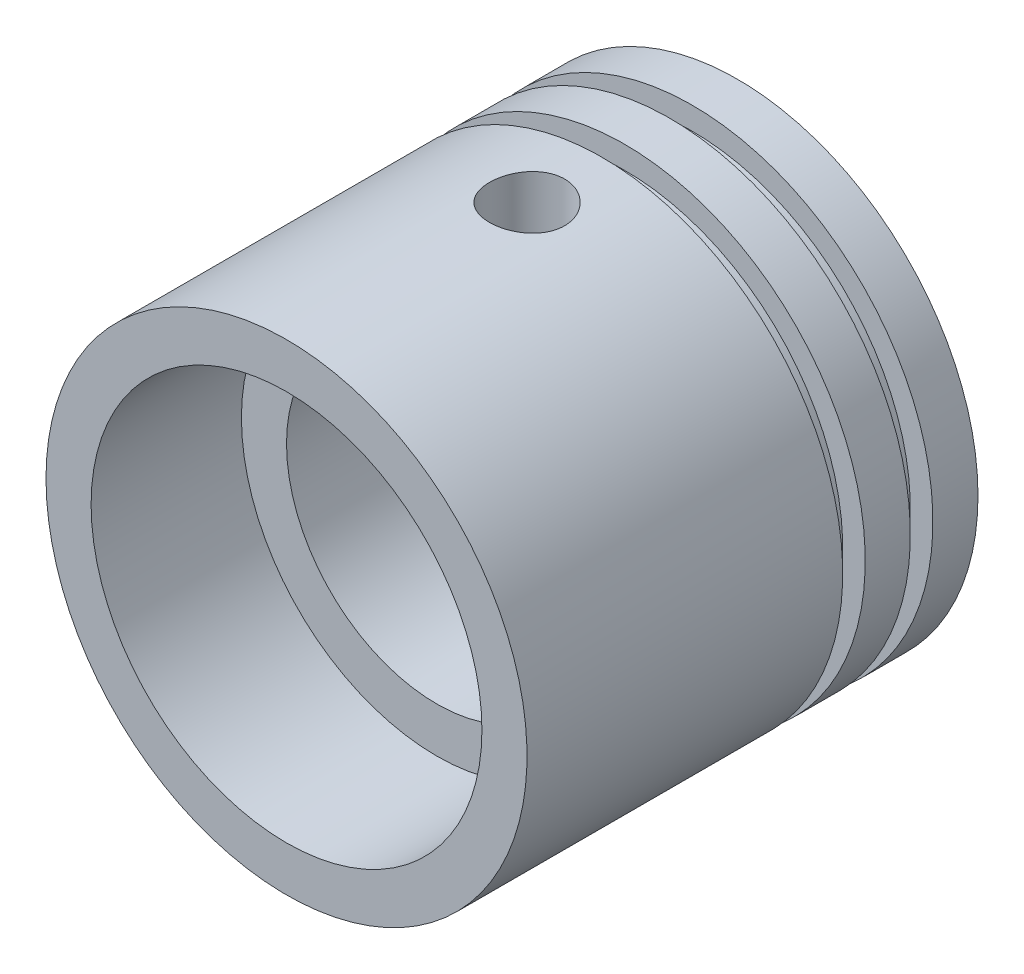
ISO-10303-21;
HEADER;
FILE_DESCRIPTION(('STEP AP214'),'2;1');
FILE_NAME('part.step','',(''),(''),'','','');
FILE_SCHEMA(('AUTOMOTIVE_DESIGN { 1 0 10303 214 1 1 1 1 }'));
ENDSEC;
DATA;
#1=APPLICATION_CONTEXT('core data for automotive mechanical design processes');
#2=APPLICATION_PROTOCOL_DEFINITION('international standard','automotive_design',2000,#1);
#3=PRODUCT_CONTEXT('',#1,'mechanical');
#4=PRODUCT('Part','Part','',(#3));
#5=PRODUCT_RELATED_PRODUCT_CATEGORY('part','',(#4));
#6=PRODUCT_DEFINITION_FORMATION('','',#4);
#7=PRODUCT_DEFINITION_CONTEXT('part definition',#1,'design');
#8=PRODUCT_DEFINITION('design','',#6,#7);
#9=PRODUCT_DEFINITION_SHAPE('','',#8);
#10=(LENGTH_UNIT() NAMED_UNIT(*) SI_UNIT(.MILLI.,.METRE.));
#11=(NAMED_UNIT(*) PLANE_ANGLE_UNIT() SI_UNIT($,.RADIAN.));
#12=(NAMED_UNIT(*) SI_UNIT($,.STERADIAN.) SOLID_ANGLE_UNIT());
#13=UNCERTAINTY_MEASURE_WITH_UNIT(LENGTH_MEASURE(1.E-05),#10,'distance_accuracy_value','');
#14=(GEOMETRIC_REPRESENTATION_CONTEXT(3) GLOBAL_UNCERTAINTY_ASSIGNED_CONTEXT((#13)) GLOBAL_UNIT_ASSIGNED_CONTEXT((#10,
#11,#12)) REPRESENTATION_CONTEXT('',''));
#15=CARTESIAN_POINT('',(0.,0.,0.));
#16=DIRECTION('',(0.,0.,1.));
#17=DIRECTION('',(1.,0.,0.));
#18=AXIS2_PLACEMENT_3D('',#15,#16,#17);
#19=CARTESIAN_POINT('',(0.,0.,20.));
#20=DIRECTION('',(0.,0.,-1.));
#21=DIRECTION('',(1.,0.,0.));
#22=AXIS2_PLACEMENT_3D('',#19,#20,#21);
#23=SPHERICAL_SURFACE('',#22,20.);
#24=CARTESIAN_POINT('',(0.,0.,0.303844939755837));
#25=DIRECTION('',(0.,0.,-1.));
#26=DIRECTION('',(-1.,0.,0.));
#27=AXIS2_PLACEMENT_3D('',#24,#25,#26);
#28=CIRCLE('',#27,3.47296355333863);
#29=CARTESIAN_POINT('',(3.47296355333863,0.,0.303844939755836));
#30=VERTEX_POINT('',#29);
#31=EDGE_CURVE('E107',#30,#30,#28,.T.);
#32=ORIENTED_EDGE('',*,*,#31,.T.);
#33=EDGE_LOOP('',(#32));
#34=FACE_BOUND('',#33,.T.);
#35=ADVANCED_FACE('F35',(#34),#23,.T.);
#36=CARTESIAN_POINT('',(0.,0.,8.51269945362056));
#37=DIRECTION('',(0.,0.,-1.));
#38=DIRECTION('',(-1.,0.,0.));
#39=AXIS2_PLACEMENT_3D('',#36,#37,#38);
#40=PLANE('',#39);
#41=CARTESIAN_POINT('',(0.,0.,8.51269945362056));
#42=DIRECTION('',(0.,0.,-1.));
#43=DIRECTION('',(-1.,0.,0.));
#44=AXIS2_PLACEMENT_3D('',#41,#42,#43);
#45=CIRCLE('',#44,10.);
#46=CARTESIAN_POINT('',(-10.,0.,8.51269945362056));
#47=VERTEX_POINT('',#46);
#48=EDGE_CURVE('E10',#47,#47,#45,.T.);
#49=ORIENTED_EDGE('',*,*,#48,.F.);
#50=EDGE_LOOP('',(#49));
#51=FACE_BOUND('',#50,.T.);
#52=ADVANCED_FACE('F93',(#51),#40,.F.);
#53=CARTESIAN_POINT('',(0.,0.,0.));
#54=DIRECTION('',(0.,0.,-1.));
#55=DIRECTION('',(-1.,0.,0.));
#56=AXIS2_PLACEMENT_3D('',#53,#54,#55);
#57=CYLINDRICAL_SURFACE('',#56,10.);
#58=CARTESIAN_POINT('',(0.,-10.,19.0126994536206));
#59=CARTESIAN_POINT('',(-0.138126814449552,-9.99999766446687,19.0126955773903));
#60=CARTESIAN_POINT('',(-0.276296929717938,-9.99710963553044,19.0012135356642));
#61=CARTESIAN_POINT('',(-0.548677206284221,-9.98586856383157,18.9556575347756));
#62=CARTESIAN_POINT('',(-0.682885078117899,-9.97751242366627,18.9215707710575));
#63=CARTESIAN_POINT('',(-0.943368120304294,-9.9562604388672,18.8319673645171));
#64=CARTESIAN_POINT('',(-1.06965260571667,-9.94337004736764,18.7764764557618));
#65=CARTESIAN_POINT('',(-1.31112021984071,-9.91442239679369,18.6457304702125));
#66=CARTESIAN_POINT('',(-1.4263029739146,-9.89836503090261,18.5704747267556));
#67=CARTESIAN_POINT('',(-1.64466987883486,-9.86445689319489,18.4006981375303));
#68=CARTESIAN_POINT('',(-1.74759281676843,-9.84657845246877,18.3058468286888));
#69=CARTESIAN_POINT('',(-1.93624821200553,-9.8112270019656,18.1002791121055));
#70=CARTESIAN_POINT('',(-2.02197872824865,-9.79375403816446,17.9895609153757));
#71=CARTESIAN_POINT('',(-2.17504423799829,-9.76091292830281,17.7533740757256));
#72=CARTESIAN_POINT('',(-2.2420870265419,-9.74557990774685,17.627710735606));
#73=CARTESIAN_POINT('',(-2.35399484758457,-9.71915824696694,17.3664521008538));
#74=CARTESIAN_POINT('',(-2.39886342573357,-9.70806892824031,17.2308583980672));
#75=CARTESIAN_POINT('',(-2.46425806134127,-9.69167461160538,16.9564602899511));
#76=CARTESIAN_POINT('',(-2.48525378055342,-9.68625818328352,16.8177746268906));
#77=CARTESIAN_POINT('',(-2.50376962511068,-9.68148937432652,16.5387518386217));
#78=CARTESIAN_POINT('',(-2.50129356969685,-9.68213600713214,16.3984149858003));
#79=CARTESIAN_POINT('',(-2.47331087439951,-9.68932009194695,16.1236731073783));
#80=CARTESIAN_POINT('',(-2.44836390031772,-9.69571438345489,15.9892067511783));
#81=CARTESIAN_POINT('',(-2.37704031150499,-9.71344516118448,15.7264310354355));
#82=CARTESIAN_POINT('',(-2.33066217011565,-9.72478199948731,15.598122115239));
#83=CARTESIAN_POINT('',(-2.21731579656197,-9.75125189842765,15.349802759867));
#84=CARTESIAN_POINT('',(-2.1501444453882,-9.76642212449693,15.2298891673046));
#85=CARTESIAN_POINT('',(-1.99726046002491,-9.79882851409985,15.0028349373592));
#86=CARTESIAN_POINT('',(-1.91154458134806,-9.81606503891047,14.8956965401751));
#87=CARTESIAN_POINT('',(-1.72110570780203,-9.85126467566485,14.6940267607966));
#88=CARTESIAN_POINT('',(-1.61591043027643,-9.86923449130001,14.599941970185));
#89=CARTESIAN_POINT('',(-1.39101986250617,-9.90343275964594,14.4306640495141));
#90=CARTESIAN_POINT('',(-1.27132412951324,-9.91966115915679,14.3554714965146));
#91=CARTESIAN_POINT('',(-1.02019314780232,-9.94862886823651,14.2259484765799));
#92=CARTESIAN_POINT('',(-0.88871898868104,-9.96135600212879,14.1716905531965));
#93=CARTESIAN_POINT('',(-0.618126680238139,-9.98179861652361,14.0861706107713));
#94=CARTESIAN_POINT('',(-0.479009998584142,-9.98951505565468,14.0549041929237));
#95=CARTESIAN_POINT('',(-0.200899950650046,-9.99892498785624,14.0169368443558));
#96=CARTESIAN_POINT('',(-0.0619945333136852,-10.0007675584713,14.0096277434951));
#97=CARTESIAN_POINT('',(0.215054791335845,-9.99864674690754,14.0181144570464));
#98=CARTESIAN_POINT('',(0.353198766074325,-9.99468388736421,14.0339081916191));
#99=CARTESIAN_POINT('',(0.622690447960816,-9.98149301878918,14.0876509676062));
#100=CARTESIAN_POINT('',(0.754108531614582,-9.97234390309647,14.1252682260822));
#101=CARTESIAN_POINT('',(1.00876215408753,-9.94981177723595,14.2212112603347));
#102=CARTESIAN_POINT('',(1.13199686505442,-9.93642833949965,14.2795391274759));
#103=CARTESIAN_POINT('',(1.36920522404972,-9.9065551321037,14.4164263350784));
#104=CARTESIAN_POINT('',(1.48297573639294,-9.89001445610999,14.4953263076148));
#105=CARTESIAN_POINT('',(1.69587768940552,-9.85574181979587,14.6706826349492));
#106=CARTESIAN_POINT('',(1.79500659828874,-9.83800965421578,14.76714201965));
#107=CARTESIAN_POINT('',(1.97831761345414,-9.80281594932498,14.9777027216934));
#108=CARTESIAN_POINT('',(2.06207311270184,-9.78537173637463,15.0921789586198));
#109=CARTESIAN_POINT('',(2.20918459835604,-9.75321463970069,15.3339205110682));
#110=CARTESIAN_POINT('',(2.27254149026901,-9.73850163474941,15.4611852585713));
#111=CARTESIAN_POINT('',(2.37658570101223,-9.71363491194665,15.7242089909643));
#112=CARTESIAN_POINT('',(2.41740732773931,-9.70345425375809,15.8599121674744));
#113=CARTESIAN_POINT('',(2.47557609990489,-9.68877906706586,16.1365488500461));
#114=CARTESIAN_POINT('',(2.49292837912652,-9.68428329504045,16.277481205323));
#115=CARTESIAN_POINT('',(2.50339765056083,-9.68158168701612,16.5562344933899));
#116=CARTESIAN_POINT('',(2.49719649630131,-9.68319887888035,16.6940285121646));
#117=CARTESIAN_POINT('',(2.46229546385366,-9.69213181672143,16.9665392680643));
#118=CARTESIAN_POINT('',(2.43359603781098,-9.69944744817731,17.1012560669759));
#119=CARTESIAN_POINT('',(2.35488553240495,-9.71885434473222,17.363046885397));
#120=CARTESIAN_POINT('',(2.30500234113404,-9.73091692061057,17.4901616290211));
#121=CARTESIAN_POINT('',(2.18544152267504,-9.7584625954084,17.7343084248098));
#122=CARTESIAN_POINT('',(2.11576115005696,-9.77394616867808,17.8513390755987));
#123=CARTESIAN_POINT('',(1.95644624772858,-9.80709390439337,18.0752905019573));
#124=CARTESIAN_POINT('',(1.86633860485376,-9.82480441386302,18.1818679093272));
#125=CARTESIAN_POINT('',(1.66964895198289,-9.86013378743769,18.3786111949462));
#126=CARTESIAN_POINT('',(1.56306303543524,-9.87775262878422,18.4687731704755));
#127=CARTESIAN_POINT('',(1.33411264450432,-9.9112942607945,18.6317183012282));
#128=CARTESIAN_POINT('',(1.21149737052731,-9.92718055609783,18.7041571430732));
#129=CARTESIAN_POINT('',(0.955443432517459,-9.95508208291861,18.8272785585214));
#130=CARTESIAN_POINT('',(0.822012605727899,-9.96710008666301,18.8779767213681));
#131=CARTESIAN_POINT('',(0.57401708873912,-9.98413432609236,18.94865250417));
#132=CARTESIAN_POINT('',(0.460633618180114,-9.99004308421151,18.972618192043));
#133=CARTESIAN_POINT('',(0.231510119227139,-9.9979767538658,19.0046426929905));
#134=CARTESIAN_POINT('',(0.115770268737694,-10.0000019575149,19.0127027024627));
#135=CARTESIAN_POINT('',(0.,-10.,19.0126994536206));
#136=B_SPLINE_CURVE_WITH_KNOTS('',3,(#58,#59,#60,#61,#62,#63,#64,#65,#66,#67,#68,#69,#70,#71,
#72,#73,#74,#75,#76,#77,#78,#79,#80,#81,#82,#83,#84,#85,#86,#87,#88,#89,#90,#91,#92,#93,#94,#95,
#96,#97,#98,#99,#100,#101,#102,#103,#104,#105,#106,#107,#108,#109,#110,#111,#112,#113,#114,#115,
#116,#117,#118,#119,#120,#121,#122,#123,#124,#125,#126,#127,#128,#129,#130,#131,#132,#133,#134,
#135),.UNSPECIFIED.,.T.,.F.,(4,2,2,2,2,2,2,2,2,2,2,2,2,2,2,2,2,2,2,2,2,2,2,2,2,2,2,2,2,2,2,2,2,
2,2,2,2,2,4),(0.,0.413956187453149,0.828147062939832,1.24184150381018,1.65554990028221,
2.07690725728565,2.4983121596677,2.92597745909678,3.35357435282281,3.77260491835116,
4.19156730193363,4.60037495017231,5.00921172448932,5.42217546462,5.83521151399138,
6.26002501620566,6.68485149269279,7.11113715020724,7.53734122819939,7.95263848254327,
8.36789835193438,8.77700457528929,9.18615212209351,9.6025597928112,10.0190393835223,
10.4457418201299,10.8724253125471,11.2965375769764,11.7205570543048,12.1323963400748,
12.5442273493652,12.9536066760887,13.3630428023796,13.7831596069298,14.2033761629383,
14.6312030917578,15.0587227304538,15.4057040491338,15.7526592674819),.UNSPECIFIED.);
#137=CARTESIAN_POINT('',(0.,-10.,19.0126994536206));
#138=VERTEX_POINT('',#137);
#139=EDGE_CURVE('E83',#138,#138,#136,.T.);
#140=ORIENTED_EDGE('',*,*,#139,.T.);
#141=EDGE_LOOP('',(#140));
#142=FACE_BOUND('',#141,.T.);
#143=CARTESIAN_POINT('',(0.,10.,19.0126994536206));
#144=CARTESIAN_POINT('',(0.138126814449552,9.99999766446687,19.0126955773903));
#145=CARTESIAN_POINT('',(0.276296929717938,9.99710963553044,19.0012135356642));
#146=CARTESIAN_POINT('',(0.548677206284221,9.98586856383157,18.9556575347756));
#147=CARTESIAN_POINT('',(0.682885078117899,9.97751242366627,18.9215707710575));
#148=CARTESIAN_POINT('',(0.943368120304294,9.9562604388672,18.8319673645171));
#149=CARTESIAN_POINT('',(1.06965260571667,9.94337004736764,18.7764764557618));
#150=CARTESIAN_POINT('',(1.31112021984071,9.91442239679369,18.6457304702125));
#151=CARTESIAN_POINT('',(1.4263029739146,9.89836503090261,18.5704747267556));
#152=CARTESIAN_POINT('',(1.64466987883486,9.86445689319489,18.4006981375303));
#153=CARTESIAN_POINT('',(1.74759281676843,9.84657845246877,18.3058468286888));
#154=CARTESIAN_POINT('',(1.93624821200553,9.8112270019656,18.1002791121055));
#155=CARTESIAN_POINT('',(2.02197872824865,9.79375403816446,17.9895609153757));
#156=CARTESIAN_POINT('',(2.17504423799829,9.76091292830281,17.7533740757256));
#157=CARTESIAN_POINT('',(2.2420870265419,9.74557990774685,17.627710735606));
#158=CARTESIAN_POINT('',(2.35399484758457,9.71915824696694,17.3664521008538));
#159=CARTESIAN_POINT('',(2.39886342573357,9.70806892824031,17.2308583980672));
#160=CARTESIAN_POINT('',(2.46425806134127,9.69167461160538,16.9564602899511));
#161=CARTESIAN_POINT('',(2.48525378055342,9.68625818328352,16.8177746268906));
#162=CARTESIAN_POINT('',(2.50376962511068,9.68148937432652,16.5387518386217));
#163=CARTESIAN_POINT('',(2.50129356969685,9.68213600713214,16.3984149858003));
#164=CARTESIAN_POINT('',(2.47331087439951,9.68932009194695,16.1236731073783));
#165=CARTESIAN_POINT('',(2.44836390031772,9.69571438345489,15.9892067511783));
#166=CARTESIAN_POINT('',(2.37704031150499,9.71344516118448,15.7264310354355));
#167=CARTESIAN_POINT('',(2.33066217011565,9.72478199948731,15.598122115239));
#168=CARTESIAN_POINT('',(2.21731579656197,9.75125189842765,15.349802759867));
#169=CARTESIAN_POINT('',(2.1501444453882,9.76642212449694,15.2298891673046));
#170=CARTESIAN_POINT('',(1.99726046002491,9.79882851409985,15.0028349373592));
#171=CARTESIAN_POINT('',(1.91154458134806,9.81606503891047,14.8956965401751));
#172=CARTESIAN_POINT('',(1.72110570780203,9.85126467566485,14.6940267607966));
#173=CARTESIAN_POINT('',(1.61591043027643,9.86923449130002,14.599941970185));
#174=CARTESIAN_POINT('',(1.39101986250617,9.90343275964594,14.4306640495141));
#175=CARTESIAN_POINT('',(1.27132412951324,9.91966115915679,14.3554714965146));
#176=CARTESIAN_POINT('',(1.02019314780232,9.94862886823651,14.2259484765799));
#177=CARTESIAN_POINT('',(0.888718988681039,9.96135600212879,14.1716905531965));
#178=CARTESIAN_POINT('',(0.618126680238138,9.98179861652361,14.0861706107713));
#179=CARTESIAN_POINT('',(0.479009998584141,9.98951505565468,14.0549041929237));
#180=CARTESIAN_POINT('',(0.200899950650044,9.99892498785624,14.0169368443558));
#181=CARTESIAN_POINT('',(0.0619945333136831,10.0007675584713,14.0096277434951));
#182=CARTESIAN_POINT('',(-0.215054791335847,9.99864674690754,14.0181144570464));
#183=CARTESIAN_POINT('',(-0.353198766074327,9.99468388736421,14.0339081916191));
#184=CARTESIAN_POINT('',(-0.622690447960817,9.98149301878918,14.0876509676062));
#185=CARTESIAN_POINT('',(-0.754108531614583,9.97234390309647,14.1252682260822));
#186=CARTESIAN_POINT('',(-1.00876215408753,9.94981177723595,14.2212112603347));
#187=CARTESIAN_POINT('',(-1.13199686505442,9.93642833949965,14.2795391274759));
#188=CARTESIAN_POINT('',(-1.36920522404972,9.9065551321037,14.4164263350784));
#189=CARTESIAN_POINT('',(-1.48297573639294,9.89001445610999,14.4953263076148));
#190=CARTESIAN_POINT('',(-1.69587768940552,9.85574181979586,14.6706826349492));
#191=CARTESIAN_POINT('',(-1.79500659828875,9.83800965421578,14.76714201965));
#192=CARTESIAN_POINT('',(-1.97831761345414,9.80281594932498,14.9777027216934));
#193=CARTESIAN_POINT('',(-2.06207311270184,9.78537173637463,15.0921789586198));
#194=CARTESIAN_POINT('',(-2.20918459835604,9.75321463970069,15.3339205110682));
#195=CARTESIAN_POINT('',(-2.27254149026901,9.73850163474941,15.4611852585713));
#196=CARTESIAN_POINT('',(-2.37658570101223,9.71363491194665,15.7242089909643));
#197=CARTESIAN_POINT('',(-2.41740732773931,9.70345425375809,15.8599121674744));
#198=CARTESIAN_POINT('',(-2.47557609990489,9.68877906706585,16.1365488500461));
#199=CARTESIAN_POINT('',(-2.49292837912652,9.68428329504044,16.277481205323));
#200=CARTESIAN_POINT('',(-2.50339765056083,9.68158168701612,16.5562344933899));
#201=CARTESIAN_POINT('',(-2.49719649630131,9.68319887888034,16.6940285121646));
#202=CARTESIAN_POINT('',(-2.46229546385366,9.69213181672143,16.9665392680643));
#203=CARTESIAN_POINT('',(-2.43359603781098,9.69944744817732,17.1012560669759));
#204=CARTESIAN_POINT('',(-2.35488553240495,9.71885434473222,17.363046885397));
#205=CARTESIAN_POINT('',(-2.30500234113404,9.73091692061057,17.4901616290211));
#206=CARTESIAN_POINT('',(-2.18544152267504,9.7584625954084,17.7343084248098));
#207=CARTESIAN_POINT('',(-2.11576115005696,9.77394616867808,17.8513390755987));
#208=CARTESIAN_POINT('',(-1.95644624772858,9.80709390439337,18.0752905019573));
#209=CARTESIAN_POINT('',(-1.86633860485376,9.82480441386302,18.1818679093272));
#210=CARTESIAN_POINT('',(-1.66964895198288,9.86013378743769,18.3786111949462));
#211=CARTESIAN_POINT('',(-1.56306303543524,9.87775262878422,18.4687731704755));
#212=CARTESIAN_POINT('',(-1.33411264450432,9.91129426079449,18.6317183012282));
#213=CARTESIAN_POINT('',(-1.21149737052731,9.92718055609783,18.7041571430732));
#214=CARTESIAN_POINT('',(-0.955443432517458,9.95508208291861,18.8272785585214));
#215=CARTESIAN_POINT('',(-0.822012605727898,9.96710008666301,18.8779767213681));
#216=CARTESIAN_POINT('',(-0.574017088739119,9.98413432609236,18.94865250417));
#217=CARTESIAN_POINT('',(-0.460633618180114,9.99004308421151,18.972618192043));
#218=CARTESIAN_POINT('',(-0.231510119227139,9.9979767538658,19.0046426929905));
#219=CARTESIAN_POINT('',(-0.115770268737694,10.0000019575149,19.0127027024627));
#220=CARTESIAN_POINT('',(0.,10.,19.0126994536206));
#221=B_SPLINE_CURVE_WITH_KNOTS('',3,(#143,#144,#145,#146,#147,#148,#149,#150,#151,#152,#153,
#154,#155,#156,#157,#158,#159,#160,#161,#162,#163,#164,#165,#166,#167,#168,#169,#170,#171,#172,
#173,#174,#175,#176,#177,#178,#179,#180,#181,#182,#183,#184,#185,#186,#187,#188,#189,#190,#191,
#192,#193,#194,#195,#196,#197,#198,#199,#200,#201,#202,#203,#204,#205,#206,#207,#208,#209,#210,
#211,#212,#213,#214,#215,#216,#217,#218,#219,#220),.UNSPECIFIED.,.T.,.F.,(4,2,2,2,2,2,2,2,2,2,2,
2,2,2,2,2,2,2,2,2,2,2,2,2,2,2,2,2,2,2,2,2,2,2,2,2,2,2,4),(0.,0.413956187453149,
0.828147062939832,1.24184150381018,1.65554990028221,2.07690725728565,2.4983121596677,
2.92597745909678,3.3535743528228,3.77260491835116,4.19156730193363,4.60037495017231,
5.00921172448932,5.42217546462,5.83521151399139,6.26002501620566,6.68485149269279,
7.11113715020724,7.53734122819939,7.95263848254328,8.36789835193439,8.7770045752893,
9.18615212209352,9.60255979281121,10.0190393835223,10.4457418201299,10.8724253125471,
11.2965375769764,11.7205570543048,12.1323963400748,12.5442273493652,12.9536066760888,
13.3630428023796,13.7831596069298,14.2033761629383,14.6312030917578,15.0587227304538,
15.4057040491338,15.752659267482),.UNSPECIFIED.);
#222=CARTESIAN_POINT('',(0.,10.,19.0126994536206));
#223=VERTEX_POINT('',#222);
#224=EDGE_CURVE('E77',#223,#223,#221,.T.);
#225=ORIENTED_EDGE('',*,*,#224,.T.);
#226=EDGE_LOOP('',(#225));
#227=FACE_BOUND('',#226,.T.);
#228=CARTESIAN_POINT('',(0.,0.,22.5126994536206));
#229=DIRECTION('',(0.,0.,-1.));
#230=DIRECTION('',(-1.,0.,0.));
#231=AXIS2_PLACEMENT_3D('',#228,#229,#230);
#232=CIRCLE('',#231,10.);
#233=CARTESIAN_POINT('',(-10.,0.,22.5126994536206));
#234=VERTEX_POINT('',#233);
#235=EDGE_CURVE('E47',#234,#234,#232,.T.);
#236=ORIENTED_EDGE('',*,*,#235,.F.);
#237=EDGE_LOOP('',(#236));
#238=FACE_BOUND('',#237,.T.);
#239=ORIENTED_EDGE('',*,*,#48,.T.);
#240=EDGE_LOOP('',(#239));
#241=FACE_BOUND('',#240,.T.);
#242=ADVANCED_FACE('F88',(#142,#227,#238,#241),#57,.F.);
#243=CARTESIAN_POINT('',(0.,0.,22.5126994536206));
#244=DIRECTION('',(0.,0.,-1.));
#245=DIRECTION('',(-1.,0.,0.));
#246=AXIS2_PLACEMENT_3D('',#243,#244,#245);
#247=PLANE('',#246);
#248=CARTESIAN_POINT('',(0.,0.,22.5126994536206));
#249=DIRECTION('',(0.,0.,-1.));
#250=DIRECTION('',(-1.,0.,0.));
#251=AXIS2_PLACEMENT_3D('',#248,#249,#250);
#252=CIRCLE('',#251,13.);
#253=CARTESIAN_POINT('',(-13.,0.,22.5126994536206));
#254=VERTEX_POINT('',#253);
#255=EDGE_CURVE('E52',#254,#254,#252,.T.);
#256=ORIENTED_EDGE('',*,*,#255,.F.);
#257=EDGE_LOOP('',(#256));
#258=FACE_BOUND('',#257,.T.);
#259=ORIENTED_EDGE('',*,*,#235,.T.);
#260=EDGE_LOOP('',(#259));
#261=FACE_BOUND('',#260,.T.);
#262=ADVANCED_FACE('F92',(#258,#261),#247,.F.);
#263=CARTESIAN_POINT('',(0.,0.,0.));
#264=DIRECTION('',(0.,0.,-1.));
#265=DIRECTION('',(-1.,0.,0.));
#266=AXIS2_PLACEMENT_3D('',#263,#264,#265);
#267=CYLINDRICAL_SURFACE('',#266,13.);
#268=CARTESIAN_POINT('',(0.,0.,32.5126994536206));
#269=DIRECTION('',(0.,0.,-1.));
#270=DIRECTION('',(-1.,0.,0.));
#271=AXIS2_PLACEMENT_3D('',#268,#269,#270);
#272=CIRCLE('',#271,13.);
#273=CARTESIAN_POINT('',(-13.,0.,32.5126994536206));
#274=VERTEX_POINT('',#273);
#275=EDGE_CURVE('E141',#274,#274,#272,.T.);
#276=ORIENTED_EDGE('',*,*,#275,.F.);
#277=EDGE_LOOP('',(#276));
#278=FACE_BOUND('',#277,.T.);
#279=ORIENTED_EDGE('',*,*,#255,.T.);
#280=EDGE_LOOP('',(#279));
#281=FACE_BOUND('',#280,.T.);
#282=ADVANCED_FACE('F146',(#278,#281),#267,.F.);
#283=CARTESIAN_POINT('',(0.,0.,32.5126994536206));
#284=DIRECTION('',(0.,0.,1.));
#285=DIRECTION('',(1.,0.,0.));
#286=AXIS2_PLACEMENT_3D('',#283,#284,#285);
#287=PLANE('',#286);
#288=ORIENTED_EDGE('',*,*,#275,.T.);
#289=EDGE_LOOP('',(#288));
#290=FACE_BOUND('',#289,.T.);
#291=CARTESIAN_POINT('',(0.,0.,32.5126994536206));
#292=DIRECTION('',(0.,0.,-1.));
#293=DIRECTION('',(-1.,0.,0.));
#294=AXIS2_PLACEMENT_3D('',#291,#292,#293);
#295=CIRCLE('',#294,16.);
#296=CARTESIAN_POINT('',(-16.,0.,32.5126994536206));
#297=VERTEX_POINT('',#296);
#298=EDGE_CURVE('E138',#297,#297,#295,.T.);
#299=ORIENTED_EDGE('',*,*,#298,.F.);
#300=EDGE_LOOP('',(#299));
#301=FACE_BOUND('',#300,.T.);
#302=ADVANCED_FACE('F155',(#290,#301),#287,.T.);
#303=CARTESIAN_POINT('',(0.,0.,0.));
#304=DIRECTION('',(0.,0.,-1.));
#305=DIRECTION('',(-1.,0.,0.));
#306=AXIS2_PLACEMENT_3D('',#303,#304,#305);
#307=CYLINDRICAL_SURFACE('',#306,16.);
#308=CARTESIAN_POINT('',(0.,-16.,19.0126994536206));
#309=CARTESIAN_POINT('',(-0.139515097271033,-15.9999977019448,19.012693755349));
#310=CARTESIAN_POINT('',(-0.279109404865704,-15.9981561248574,19.000981339847));
#311=CARTESIAN_POINT('',(-0.554391314978101,-15.9909869809759,18.9544557623438));
#312=CARTESIAN_POINT('',(-0.690075061323317,-15.9856560884472,18.9196205611171));
#313=CARTESIAN_POINT('',(-0.953512538047404,-15.9721069716578,18.8279197908139));
#314=CARTESIAN_POINT('',(-1.0812723522899,-15.9638909956317,18.771071372259));
#315=CARTESIAN_POINT('',(-1.3254212510446,-15.9454779403815,18.637000908479));
#316=CARTESIAN_POINT('',(-1.44181181036831,-15.9352811186255,18.5597815105846));
#317=CARTESIAN_POINT('',(-1.66091991165162,-15.9139426841436,18.3864664052666));
#318=CARTESIAN_POINT('',(-1.76352747914264,-15.9027945139234,18.2902324587303));
#319=CARTESIAN_POINT('',(-1.95120768822823,-15.8808607613029,18.0819175053517));
#320=CARTESIAN_POINT('',(-2.03627928654192,-15.8700752005075,17.9698355563204));
#321=CARTESIAN_POINT('',(-2.18690544328884,-15.8500242812745,17.7322611822768));
#322=CARTESIAN_POINT('',(-2.25235273557991,-15.840767397861,17.6066999712588));
#323=CARTESIAN_POINT('',(-2.36118681597065,-15.8249120174236,17.3461980427628));
#324=CARTESIAN_POINT('',(-2.40457491010063,-15.8183133630222,17.21125788111));
#325=CARTESIAN_POINT('',(-2.46771559322167,-15.8085863451104,16.9369885524768));
#326=CARTESIAN_POINT('',(-2.48765705487496,-15.8054302653236,16.7977038678018));
#327=CARTESIAN_POINT('',(-2.50392369757621,-15.8028617107177,16.5177322647279));
#328=CARTESIAN_POINT('',(-2.50025034860466,-15.8034490028802,16.3770454341545));
#329=CARTESIAN_POINT('',(-2.4695458080889,-15.8082755045521,16.0996024217679));
#330=CARTESIAN_POINT('',(-2.44272562959693,-15.8124817218495,15.9628222302674));
#331=CARTESIAN_POINT('',(-2.36681937833751,-15.8240205634547,15.6957274472612));
#332=CARTESIAN_POINT('',(-2.31773262684132,-15.8313532830641,15.56541305298));
#333=CARTESIAN_POINT('',(-2.19846916949384,-15.8483550685462,15.3143107409434));
#334=CARTESIAN_POINT('',(-2.12820372315549,-15.8580339308724,15.1935656618475));
#335=CARTESIAN_POINT('',(-1.96864058146637,-15.878630461501,14.965499917935));
#336=CARTESIAN_POINT('',(-1.87934153253016,-15.8895482178821,14.8581802087331));
#337=CARTESIAN_POINT('',(-1.68309088822333,-15.911537862489,14.6587892069873));
#338=CARTESIAN_POINT('',(-1.57595800560539,-15.9226101363559,14.5668962953511));
#339=CARTESIAN_POINT('',(-1.34769694737936,-15.9435512534783,14.4023663079807));
#340=CARTESIAN_POINT('',(-1.22656870068132,-15.9534200906202,14.3297293300637));
#341=CARTESIAN_POINT('',(-0.97359592705649,-15.9708539902704,14.2057613801982));
#342=CARTESIAN_POINT('',(-0.841744186240459,-15.9784174854193,14.1544448950876));
#343=CARTESIAN_POINT('',(-0.571149534696759,-15.9903756000068,14.0747334861733));
#344=CARTESIAN_POINT('',(-0.4324071306872,-15.9947704520898,14.0463368795541));
#345=CARTESIAN_POINT('',(-0.153508336763735,-15.9998651172728,14.0135101771704));
#346=CARTESIAN_POINT('',(-0.0133814615087019,-16.0006027179286,14.0088349746444));
#347=CARTESIAN_POINT('',(0.265654546411642,-15.9984028649127,14.0229321589565));
#348=CARTESIAN_POINT('',(0.404563719925155,-15.9954655349964,14.0417037562097));
#349=CARTESIAN_POINT('',(0.676473446265703,-15.9862692369322,14.1019578413007));
#350=CARTESIAN_POINT('',(0.80950126205604,-15.9800278421539,14.1433202118883));
#351=CARTESIAN_POINT('',(1.06673406785662,-15.9649207568356,14.2474545480194));
#352=CARTESIAN_POINT('',(1.1909386130394,-15.9560549341007,14.3102275920632));
#353=CARTESIAN_POINT('',(1.42807220225041,-15.9365897274094,14.4559714447471));
#354=CARTESIAN_POINT('',(1.54090512378372,-15.9259772866342,14.539096873711));
#355=CARTESIAN_POINT('',(1.75110696507806,-15.9042388046444,14.7229715395284));
#356=CARTESIAN_POINT('',(1.84847490447018,-15.8931127309268,14.8237218928254));
#357=CARTESIAN_POINT('',(2.02588080776691,-15.8714802753665,15.0410806508378));
#358=CARTESIAN_POINT('',(2.10575398584126,-15.860980411908,15.1578243007429));
#359=CARTESIAN_POINT('',(2.2447556772664,-15.8419069280583,15.4032155272819));
#360=CARTESIAN_POINT('',(2.30388478778105,-15.83333325222,15.53186276111));
#361=CARTESIAN_POINT('',(2.39946771944994,-15.8191307135236,15.7969290943348));
#362=CARTESIAN_POINT('',(2.43600654947912,-15.8134908234896,15.9333169223862));
#363=CARTESIAN_POINT('',(2.48564122040535,-15.8057657028079,16.2103885972845));
#364=CARTESIAN_POINT('',(2.49873883084997,-15.8036802038444,16.3510721190396));
#365=CARTESIAN_POINT('',(2.50107452690756,-15.8033105804488,16.631098169528));
#366=CARTESIAN_POINT('',(2.49057180548425,-15.804985160429,16.7704385505541));
#367=CARTESIAN_POINT('',(2.44656223255901,-15.8118569894183,17.0453447507649));
#368=CARTESIAN_POINT('',(2.41305543086961,-15.8170542307995,17.1809105781223));
#369=CARTESIAN_POINT('',(2.32408329891851,-15.8303708885491,17.4443372802611));
#370=CARTESIAN_POINT('',(2.26863761738581,-15.8384876895341,17.572204931879));
#371=CARTESIAN_POINT('',(2.13738768546417,-15.856731840474,17.8168650672968));
#372=CARTESIAN_POINT('',(2.06158262820886,-15.8668592701083,17.933657111909));
#373=CARTESIAN_POINT('',(1.8908300813908,-15.8881156809226,18.1541649977474));
#374=CARTESIAN_POINT('',(1.79569107094768,-15.8992540116029,18.2577316502344));
#375=CARTESIAN_POINT('',(1.58937594638204,-15.9212004364073,18.4475206900073));
#376=CARTESIAN_POINT('',(1.47819612078432,-15.9320084534012,18.5337390522124));
#377=CARTESIAN_POINT('',(1.24216685884341,-15.952151024567,18.6868506766521));
#378=CARTESIAN_POINT('',(1.11723937214238,-15.9614763443027,18.7536248263802));
#379=CARTESIAN_POINT('',(0.857851882357785,-15.9775125983888,18.8651404498135));
#380=CARTESIAN_POINT('',(0.723401776581763,-15.9842262014212,18.909904426179));
#381=CARTESIAN_POINT('',(0.490314239911595,-15.9927744586488,18.9661324747111));
#382=CARTESIAN_POINT('',(0.393105575651626,-15.9954699162612,18.9835679442496));
#383=CARTESIAN_POINT('',(0.197277797850582,-15.9990834869762,19.0068533669996));
#384=CARTESIAN_POINT('',(0.0986587041691187,-16.0000016250796,19.0127034831779));
#385=CARTESIAN_POINT('',(0.,-16.,19.0126994536206));
#386=B_SPLINE_CURVE_WITH_KNOTS('',3,(#308,#309,#310,#311,#312,#313,#314,#315,#316,#317,#318,
#319,#320,#321,#322,#323,#324,#325,#326,#327,#328,#329,#330,#331,#332,#333,#334,#335,#336,#337,
#338,#339,#340,#341,#342,#343,#344,#345,#346,#347,#348,#349,#350,#351,#352,#353,#354,#355,#356,
#357,#358,#359,#360,#361,#362,#363,#364,#365,#366,#367,#368,#369,#370,#371,#372,#373,#374,#375,
#376,#377,#378,#379,#380,#381,#382,#383,#384,#385),.UNSPECIFIED.,.T.,.F.,(4,2,2,2,2,2,2,2,2,2,2,
2,2,2,2,2,2,2,2,2,2,2,2,2,2,2,2,2,2,2,2,2,2,2,2,2,2,2,4),(0.,0.41818474047749,0.836768642528013,
1.25502707944103,1.6732311879203,2.09459568152199,2.51598523645421,2.93963778605759,
3.36326525009238,3.78345631134994,4.20362121670545,4.6199957602258,5.0363829965105,
5.45453977402347,5.87272629892068,6.29545732334366,6.71819049513827,7.14121043754564,
7.56419931829866,7.98280854005914,8.40140366528356,8.81779444756566,9.2342062074203,
9.65388541469671,10.0735912160142,10.4970948024959,10.9205861964898,11.3424741039513,
11.7643301622929,12.1815758159869,12.598820566189,13.0156924696662,13.4325808967135,
13.8538201231554,14.275156971423,14.6990230419984,15.1224548565628,15.4181801635154,
15.7139013105871),.UNSPECIFIED.);
#387=CARTESIAN_POINT('',(0.,-16.,19.0126994536206));
#388=VERTEX_POINT('',#387);
#389=EDGE_CURVE('E38',#388,#388,#386,.T.);
#390=ORIENTED_EDGE('',*,*,#389,.F.);
#391=EDGE_LOOP('',(#390));
#392=FACE_BOUND('',#391,.T.);
#393=CARTESIAN_POINT('',(0.,16.,19.0126994536206));
#394=CARTESIAN_POINT('',(0.139515097271033,15.9999977019448,19.012693755349));
#395=CARTESIAN_POINT('',(0.279109404865704,15.9981561248574,19.000981339847));
#396=CARTESIAN_POINT('',(0.554391314978101,15.9909869809759,18.9544557623438));
#397=CARTESIAN_POINT('',(0.690075061323317,15.9856560884472,18.9196205611171));
#398=CARTESIAN_POINT('',(0.953512538047404,15.9721069716578,18.8279197908139));
#399=CARTESIAN_POINT('',(1.0812723522899,15.9638909956317,18.771071372259));
#400=CARTESIAN_POINT('',(1.3254212510446,15.9454779403815,18.637000908479));
#401=CARTESIAN_POINT('',(1.44181181036831,15.9352811186255,18.5597815105846));
#402=CARTESIAN_POINT('',(1.66091991165162,15.9139426841436,18.3864664052666));
#403=CARTESIAN_POINT('',(1.76352747914264,15.9027945139234,18.2902324587303));
#404=CARTESIAN_POINT('',(1.95120768822823,15.8808607613029,18.0819175053517));
#405=CARTESIAN_POINT('',(2.03627928654192,15.8700752005075,17.9698355563204));
#406=CARTESIAN_POINT('',(2.18690544328884,15.8500242812745,17.7322611822768));
#407=CARTESIAN_POINT('',(2.25235273557991,15.840767397861,17.6066999712588));
#408=CARTESIAN_POINT('',(2.36118681597065,15.8249120174236,17.3461980427628));
#409=CARTESIAN_POINT('',(2.40457491010063,15.8183133630222,17.21125788111));
#410=CARTESIAN_POINT('',(2.46771559322167,15.8085863451104,16.9369885524768));
#411=CARTESIAN_POINT('',(2.48765705487496,15.8054302653236,16.7977038678018));
#412=CARTESIAN_POINT('',(2.50392369757621,15.8028617107177,16.5177322647279));
#413=CARTESIAN_POINT('',(2.50025034860466,15.8034490028802,16.3770454341545));
#414=CARTESIAN_POINT('',(2.4695458080889,15.8082755045521,16.0996024217679));
#415=CARTESIAN_POINT('',(2.44272562959693,15.8124817218495,15.9628222302674));
#416=CARTESIAN_POINT('',(2.36681937833751,15.8240205634547,15.6957274472612));
#417=CARTESIAN_POINT('',(2.31773262684132,15.8313532830641,15.56541305298));
#418=CARTESIAN_POINT('',(2.19846916949384,15.8483550685462,15.3143107409434));
#419=CARTESIAN_POINT('',(2.12820372315549,15.8580339308724,15.1935656618475));
#420=CARTESIAN_POINT('',(1.96864058146637,15.878630461501,14.965499917935));
#421=CARTESIAN_POINT('',(1.87934153253016,15.8895482178821,14.8581802087331));
#422=CARTESIAN_POINT('',(1.68309088822333,15.911537862489,14.6587892069873));
#423=CARTESIAN_POINT('',(1.57595800560539,15.9226101363559,14.5668962953511));
#424=CARTESIAN_POINT('',(1.34769694737936,15.9435512534783,14.4023663079807));
#425=CARTESIAN_POINT('',(1.22656870068132,15.9534200906202,14.3297293300637));
#426=CARTESIAN_POINT('',(0.973595927056492,15.9708539902704,14.2057613801982));
#427=CARTESIAN_POINT('',(0.841744186240461,15.9784174854193,14.1544448950876));
#428=CARTESIAN_POINT('',(0.57114953469676,15.9903756000068,14.0747334861733));
#429=CARTESIAN_POINT('',(0.432407130687201,15.9947704520898,14.0463368795541));
#430=CARTESIAN_POINT('',(0.153508336763736,15.9998651172728,14.0135101771704));
#431=CARTESIAN_POINT('',(0.0133814615087031,16.0006027179286,14.0088349746444));
#432=CARTESIAN_POINT('',(-0.26565454641164,15.9984028649127,14.0229321589565));
#433=CARTESIAN_POINT('',(-0.404563719925154,15.9954655349964,14.0417037562097));
#434=CARTESIAN_POINT('',(-0.676473446265703,15.9862692369322,14.1019578413007));
#435=CARTESIAN_POINT('',(-0.80950126205604,15.9800278421539,14.1433202118883));
#436=CARTESIAN_POINT('',(-1.06673406785662,15.9649207568356,14.2474545480194));
#437=CARTESIAN_POINT('',(-1.19093861303941,15.9560549341007,14.3102275920632));
#438=CARTESIAN_POINT('',(-1.42807220225041,15.9365897274094,14.4559714447471));
#439=CARTESIAN_POINT('',(-1.54090512378372,15.9259772866342,14.539096873711));
#440=CARTESIAN_POINT('',(-1.75110696507806,15.9042388046444,14.7229715395284));
#441=CARTESIAN_POINT('',(-1.84847490447018,15.8931127309268,14.8237218928254));
#442=CARTESIAN_POINT('',(-2.02588080776691,15.8714802753665,15.0410806508378));
#443=CARTESIAN_POINT('',(-2.10575398584126,15.860980411908,15.1578243007429));
#444=CARTESIAN_POINT('',(-2.2447556772664,15.8419069280583,15.4032155272819));
#445=CARTESIAN_POINT('',(-2.30388478778105,15.83333325222,15.53186276111));
#446=CARTESIAN_POINT('',(-2.39946771944994,15.8191307135236,15.7969290943348));
#447=CARTESIAN_POINT('',(-2.43600654947912,15.8134908234896,15.9333169223862));
#448=CARTESIAN_POINT('',(-2.48564122040535,15.8057657028079,16.2103885972845));
#449=CARTESIAN_POINT('',(-2.49873883084997,15.8036802038444,16.3510721190396));
#450=CARTESIAN_POINT('',(-2.50107452690756,15.8033105804488,16.631098169528));
#451=CARTESIAN_POINT('',(-2.49057180548425,15.804985160429,16.7704385505541));
#452=CARTESIAN_POINT('',(-2.44656223255901,15.8118569894183,17.0453447507649));
#453=CARTESIAN_POINT('',(-2.41305543086961,15.8170542307995,17.1809105781223));
#454=CARTESIAN_POINT('',(-2.32408329891851,15.8303708885491,17.4443372802611));
#455=CARTESIAN_POINT('',(-2.26863761738581,15.8384876895341,17.572204931879));
#456=CARTESIAN_POINT('',(-2.13738768546417,15.856731840474,17.8168650672968));
#457=CARTESIAN_POINT('',(-2.06158262820886,15.8668592701083,17.933657111909));
#458=CARTESIAN_POINT('',(-1.8908300813908,15.8881156809226,18.1541649977474));
#459=CARTESIAN_POINT('',(-1.79569107094768,15.8992540116029,18.2577316502344));
#460=CARTESIAN_POINT('',(-1.58937594638204,15.9212004364073,18.4475206900073));
#461=CARTESIAN_POINT('',(-1.47819612078432,15.9320084534012,18.5337390522124));
#462=CARTESIAN_POINT('',(-1.24216685884341,15.952151024567,18.6868506766521));
#463=CARTESIAN_POINT('',(-1.11723937214238,15.9614763443027,18.7536248263802));
#464=CARTESIAN_POINT('',(-0.857851882357784,15.9775125983888,18.8651404498135));
#465=CARTESIAN_POINT('',(-0.723401776581762,15.9842262014212,18.909904426179));
#466=CARTESIAN_POINT('',(-0.490314239911594,15.9927744586488,18.9661324747111));
#467=CARTESIAN_POINT('',(-0.393105575651625,15.9954699162612,18.9835679442496));
#468=CARTESIAN_POINT('',(-0.197277797850581,15.9990834869762,19.0068533669996));
#469=CARTESIAN_POINT('',(-0.0986587041691183,16.0000016250796,19.0127034831779));
#470=CARTESIAN_POINT('',(0.,16.,19.0126994536206));
#471=B_SPLINE_CURVE_WITH_KNOTS('',3,(#393,#394,#395,#396,#397,#398,#399,#400,#401,#402,#403,
#404,#405,#406,#407,#408,#409,#410,#411,#412,#413,#414,#415,#416,#417,#418,#419,#420,#421,#422,
#423,#424,#425,#426,#427,#428,#429,#430,#431,#432,#433,#434,#435,#436,#437,#438,#439,#440,#441,
#442,#443,#444,#445,#446,#447,#448,#449,#450,#451,#452,#453,#454,#455,#456,#457,#458,#459,#460,
#461,#462,#463,#464,#465,#466,#467,#468,#469,#470),.UNSPECIFIED.,.T.,.F.,(4,2,2,2,2,2,2,2,2,2,2,
2,2,2,2,2,2,2,2,2,2,2,2,2,2,2,2,2,2,2,2,2,2,2,2,2,2,2,4),(0.,0.41818474047749,0.836768642528013,
1.25502707944103,1.6732311879203,2.09459568152199,2.51598523645421,2.93963778605759,
3.36326525009238,3.78345631134994,4.20362121670545,4.6199957602258,5.0363829965105,
5.45453977402347,5.87272629892068,6.29545732334366,6.71819049513826,7.14121043754564,
7.56419931829865,7.98280854005914,8.40140366528356,8.81779444756566,9.2342062074203,
9.65388541469671,10.0735912160142,10.4970948024959,10.9205861964898,11.3424741039513,
11.764330162293,12.1815758159869,12.598820566189,13.0156924696662,13.4325808967135,
13.8538201231554,14.275156971423,14.6990230419984,15.1224548565628,15.4181801635154,
15.7139013105871),.UNSPECIFIED.);
#472=CARTESIAN_POINT('',(0.,16.,19.0126994536206));
#473=VERTEX_POINT('',#472);
#474=EDGE_CURVE('E55',#473,#473,#471,.T.);
#475=ORIENTED_EDGE('',*,*,#474,.F.);
#476=EDGE_LOOP('',(#475));
#477=FACE_BOUND('',#476,.T.);
#478=ORIENTED_EDGE('',*,*,#298,.T.);
#479=EDGE_LOOP('',(#478));
#480=FACE_BOUND('',#479,.T.);
#481=CARTESIAN_POINT('',(0.,0.,11.5126994536206));
#482=DIRECTION('',(0.,0.,-1.));
#483=DIRECTION('',(-1.,0.,0.));
#484=AXIS2_PLACEMENT_3D('',#481,#482,#483);
#485=CIRCLE('',#484,16.);
#486=CARTESIAN_POINT('',(-16.,0.,11.5126994536206));
#487=VERTEX_POINT('',#486);
#488=EDGE_CURVE('E135',#487,#487,#485,.T.);
#489=ORIENTED_EDGE('',*,*,#488,.F.);
#490=EDGE_LOOP('',(#489));
#491=FACE_BOUND('',#490,.T.);
#492=ADVANCED_FACE('F60',(#392,#477,#480,#491),#307,.T.);
#493=CARTESIAN_POINT('',(0.,0.,11.5126994536206));
#494=DIRECTION('',(0.,0.,-1.));
#495=DIRECTION('',(-1.,0.,0.));
#496=AXIS2_PLACEMENT_3D('',#493,#494,#495);
#497=PLANE('',#496);
#498=ORIENTED_EDGE('',*,*,#488,.T.);
#499=EDGE_LOOP('',(#498));
#500=FACE_BOUND('',#499,.T.);
#501=CARTESIAN_POINT('',(0.,0.,11.5126994536206));
#502=DIRECTION('',(0.,0.,-1.));
#503=DIRECTION('',(-1.,0.,0.));
#504=AXIS2_PLACEMENT_3D('',#501,#502,#503);
#505=CIRCLE('',#504,14.5);
#506=CARTESIAN_POINT('',(-14.5,0.,11.5126994536206));
#507=VERTEX_POINT('',#506);
#508=EDGE_CURVE('E132',#507,#507,#505,.T.);
#509=ORIENTED_EDGE('',*,*,#508,.F.);
#510=EDGE_LOOP('',(#509));
#511=FACE_BOUND('',#510,.T.);
#512=ADVANCED_FACE('F167',(#500,#511),#497,.T.);
#513=CARTESIAN_POINT('',(0.,0.,0.));
#514=DIRECTION('',(0.,0.,-1.));
#515=DIRECTION('',(-1.,0.,0.));
#516=AXIS2_PLACEMENT_3D('',#513,#514,#515);
#517=CYLINDRICAL_SURFACE('',#516,14.5);
#518=ORIENTED_EDGE('',*,*,#508,.T.);
#519=EDGE_LOOP('',(#518));
#520=FACE_BOUND('',#519,.T.);
#521=CARTESIAN_POINT('',(0.,0.,10.0126994536206));
#522=DIRECTION('',(0.,0.,-1.));
#523=DIRECTION('',(-1.,0.,0.));
#524=AXIS2_PLACEMENT_3D('',#521,#522,#523);
#525=CIRCLE('',#524,14.5);
#526=CARTESIAN_POINT('',(-14.5,0.,10.0126994536206));
#527=VERTEX_POINT('',#526);
#528=EDGE_CURVE('E129',#527,#527,#525,.T.);
#529=ORIENTED_EDGE('',*,*,#528,.F.);
#530=EDGE_LOOP('',(#529));
#531=FACE_BOUND('',#530,.T.);
#532=ADVANCED_FACE('F173',(#520,#531),#517,.T.);
#533=CARTESIAN_POINT('',(0.,0.,10.0126994536206));
#534=DIRECTION('',(0.,0.,1.));
#535=DIRECTION('',(1.,0.,0.));
#536=AXIS2_PLACEMENT_3D('',#533,#534,#535);
#537=PLANE('',#536);
#538=ORIENTED_EDGE('',*,*,#528,.T.);
#539=EDGE_LOOP('',(#538));
#540=FACE_BOUND('',#539,.T.);
#541=CARTESIAN_POINT('',(0.,0.,10.0126994536206));
#542=DIRECTION('',(0.,0.,-1.));
#543=DIRECTION('',(-1.,0.,0.));
#544=AXIS2_PLACEMENT_3D('',#541,#542,#543);
#545=CIRCLE('',#544,16.);
#546=CARTESIAN_POINT('',(-16.,0.,10.0126994536206));
#547=VERTEX_POINT('',#546);
#548=EDGE_CURVE('E126',#547,#547,#545,.T.);
#549=ORIENTED_EDGE('',*,*,#548,.F.);
#550=EDGE_LOOP('',(#549));
#551=FACE_BOUND('',#550,.T.);
#552=ADVANCED_FACE('F178',(#540,#551),#537,.T.);
#553=CARTESIAN_POINT('',(0.,0.,0.));
#554=DIRECTION('',(0.,0.,-1.));
#555=DIRECTION('',(-1.,0.,0.));
#556=AXIS2_PLACEMENT_3D('',#553,#554,#555);
#557=CYLINDRICAL_SURFACE('',#556,16.);
#558=ORIENTED_EDGE('',*,*,#548,.T.);
#559=EDGE_LOOP('',(#558));
#560=FACE_BOUND('',#559,.T.);
#561=CARTESIAN_POINT('',(0.,0.,7.01269945362055));
#562=DIRECTION('',(0.,0.,-1.));
#563=DIRECTION('',(-1.,0.,0.));
#564=AXIS2_PLACEMENT_3D('',#561,#562,#563);
#565=CIRCLE('',#564,16.);
#566=CARTESIAN_POINT('',(-16.,0.,7.01269945362055));
#567=VERTEX_POINT('',#566);
#568=EDGE_CURVE('E123',#567,#567,#565,.T.);
#569=ORIENTED_EDGE('',*,*,#568,.F.);
#570=EDGE_LOOP('',(#569));
#571=FACE_BOUND('',#570,.T.);
#572=ADVANCED_FACE('F184',(#560,#571),#557,.T.);
#573=CARTESIAN_POINT('',(0.,0.,7.01269945362055));
#574=DIRECTION('',(0.,0.,-1.));
#575=DIRECTION('',(-1.,0.,0.));
#576=AXIS2_PLACEMENT_3D('',#573,#574,#575);
#577=PLANE('',#576);
#578=ORIENTED_EDGE('',*,*,#568,.T.);
#579=EDGE_LOOP('',(#578));
#580=FACE_BOUND('',#579,.T.);
#581=CARTESIAN_POINT('',(0.,0.,7.01269945362055));
#582=DIRECTION('',(0.,0.,-1.));
#583=DIRECTION('',(-1.,0.,0.));
#584=AXIS2_PLACEMENT_3D('',#581,#582,#583);
#585=CIRCLE('',#584,14.5);
#586=CARTESIAN_POINT('',(-14.5,0.,7.01269945362055));
#587=VERTEX_POINT('',#586);
#588=EDGE_CURVE('E120',#587,#587,#585,.T.);
#589=ORIENTED_EDGE('',*,*,#588,.F.);
#590=EDGE_LOOP('',(#589));
#591=FACE_BOUND('',#590,.T.);
#592=ADVANCED_FACE('F190',(#580,#591),#577,.T.);
#593=CARTESIAN_POINT('',(0.,0.,0.));
#594=DIRECTION('',(0.,0.,-1.));
#595=DIRECTION('',(-1.,0.,0.));
#596=AXIS2_PLACEMENT_3D('',#593,#594,#595);
#597=CYLINDRICAL_SURFACE('',#596,14.5);
#598=ORIENTED_EDGE('',*,*,#588,.T.);
#599=EDGE_LOOP('',(#598));
#600=FACE_BOUND('',#599,.T.);
#601=CARTESIAN_POINT('',(0.,0.,5.51269945362055));
#602=DIRECTION('',(0.,0.,-1.));
#603=DIRECTION('',(-1.,0.,0.));
#604=AXIS2_PLACEMENT_3D('',#601,#602,#603);
#605=CIRCLE('',#604,14.5);
#606=CARTESIAN_POINT('',(-14.5,0.,5.51269945362055));
#607=VERTEX_POINT('',#606);
#608=EDGE_CURVE('E117',#607,#607,#605,.T.);
#609=ORIENTED_EDGE('',*,*,#608,.F.);
#610=EDGE_LOOP('',(#609));
#611=FACE_BOUND('',#610,.T.);
#612=ADVANCED_FACE('F196',(#600,#611),#597,.T.);
#613=CARTESIAN_POINT('',(0.,0.,5.51269945362055));
#614=DIRECTION('',(0.,0.,1.));
#615=DIRECTION('',(1.,0.,0.));
#616=AXIS2_PLACEMENT_3D('',#613,#614,#615);
#617=PLANE('',#616);
#618=ORIENTED_EDGE('',*,*,#608,.T.);
#619=EDGE_LOOP('',(#618));
#620=FACE_BOUND('',#619,.T.);
#621=CARTESIAN_POINT('',(0.,0.,5.51269945362055));
#622=DIRECTION('',(0.,0.,-1.));
#623=DIRECTION('',(-1.,0.,0.));
#624=AXIS2_PLACEMENT_3D('',#621,#622,#623);
#625=CIRCLE('',#624,16.);
#626=CARTESIAN_POINT('',(-16.,0.,5.51269945362055));
#627=VERTEX_POINT('',#626);
#628=EDGE_CURVE('E111',#627,#627,#625,.T.);
#629=ORIENTED_EDGE('',*,*,#628,.F.);
#630=EDGE_LOOP('',(#629));
#631=FACE_BOUND('',#630,.T.);
#632=ADVANCED_FACE('F202',(#620,#631),#617,.T.);
#633=CARTESIAN_POINT('',(0.,0.,0.));
#634=DIRECTION('',(0.,0.,-1.));
#635=DIRECTION('',(-1.,0.,0.));
#636=AXIS2_PLACEMENT_3D('',#633,#634,#635);
#637=CYLINDRICAL_SURFACE('',#636,16.);
#638=ORIENTED_EDGE('',*,*,#628,.T.);
#639=EDGE_LOOP('',(#638));
#640=FACE_BOUND('',#639,.T.);
#641=CARTESIAN_POINT('',(0.,0.,2.51269945362055));
#642=DIRECTION('',(0.,0.,-1.));
#643=DIRECTION('',(-1.,0.,0.));
#644=AXIS2_PLACEMENT_3D('',#641,#642,#643);
#645=CIRCLE('',#644,16.);
#646=CARTESIAN_POINT('',(16.,0.,2.51269945362055));
#647=VERTEX_POINT('',#646);
#648=EDGE_CURVE('E109',#647,#647,#645,.T.);
#649=ORIENTED_EDGE('',*,*,#648,.F.);
#650=EDGE_LOOP('',(#649));
#651=FACE_BOUND('',#650,.T.);
#652=ADVANCED_FACE('F208',(#640,#651),#637,.T.);
#653=CARTESIAN_POINT('',(0.,0.,0.303844939755837));
#654=DIRECTION('',(0.,0.,1.));
#655=DIRECTION('',(1.,0.,0.));
#656=AXIS2_PLACEMENT_3D('',#653,#654,#655);
#657=CONICAL_SURFACE('',#656,3.47296355333863,1.39626340159546);
#658=CARTESIAN_POINT('',(16.,0.,2.51269945362055));
#659=CARTESIAN_POINT('',(15.8695100370139,0.,2.48969055243446));
#660=CARTESIAN_POINT('',(15.7390200740279,0.,2.46668165124836));
#661=CARTESIAN_POINT('',(15.4780401480558,0.,2.42066384887618));
#662=CARTESIAN_POINT('',(15.3475501850697,0.,2.39765494769009));
#663=CARTESIAN_POINT('',(15.0865702590976,0.,2.35163714531791));
#664=CARTESIAN_POINT('',(14.9560802961116,0.,2.32862824413182));
#665=CARTESIAN_POINT('',(14.6951003701394,0.,2.28261044175964));
#666=CARTESIAN_POINT('',(14.5646104071534,0.,2.25960154057355));
#667=CARTESIAN_POINT('',(14.3036304811813,0.,2.21358373820137));
#668=CARTESIAN_POINT('',(14.1731405181952,0.,2.19057483701528));
#669=CARTESIAN_POINT('',(13.9121605922231,0.,2.14455703464309));
#670=CARTESIAN_POINT('',(13.7816706292371,0.,2.121548133457));
#671=CARTESIAN_POINT('',(13.5206907032649,0.,2.07553033108482));
#672=CARTESIAN_POINT('',(13.3902007402789,0.,2.05252142989873));
#673=CARTESIAN_POINT('',(13.1292208143068,0.,2.00650362752655));
#674=CARTESIAN_POINT('',(12.9987308513207,0.,1.98349472634046));
#675=CARTESIAN_POINT('',(12.7377509253486,0.,1.93747692396828));
#676=CARTESIAN_POINT('',(12.6072609623625,0.,1.91446802278219));
#677=CARTESIAN_POINT('',(12.3462810363904,0.,1.86845022041001));
#678=CARTESIAN_POINT('',(12.2157910734044,0.,1.84544131922391));
#679=CARTESIAN_POINT('',(11.9548111474323,0.,1.79942351685173));
#680=CARTESIAN_POINT('',(11.8243211844462,0.,1.77641461566564));
#681=CARTESIAN_POINT('',(11.5633412584741,0.,1.73039681329346));
#682=CARTESIAN_POINT('',(11.432851295488,0.,1.70738791210737));
#683=CARTESIAN_POINT('',(11.1718713695159,0.,1.66137010973519));
#684=CARTESIAN_POINT('',(11.0413814065299,0.,1.6383612085491));
#685=CARTESIAN_POINT('',(10.7804014805578,0.,1.59234340617692));
#686=CARTESIAN_POINT('',(10.6499115175717,0.,1.56933450499083));
#687=CARTESIAN_POINT('',(10.3889315915996,0.,1.52331670261864));
#688=CARTESIAN_POINT('',(10.2584416286135,0.,1.50030780143255));
#689=CARTESIAN_POINT('',(9.99746170264143,0.,1.45428999906037));
#690=CARTESIAN_POINT('',(9.86697173965537,0.,1.43128109787428));
#691=CARTESIAN_POINT('',(9.60599181368326,0.,1.3852632955021));
#692=CARTESIAN_POINT('',(9.4755018506972,0.,1.36225439431601));
#693=CARTESIAN_POINT('',(9.21452192472509,0.,1.31623659194383));
#694=CARTESIAN_POINT('',(9.08403196173904,0.,1.29322769075774));
#695=CARTESIAN_POINT('',(8.82305203576692,0.,1.24720988838556));
#696=CARTESIAN_POINT('',(8.69256207278087,0.,1.22420098719947));
#697=CARTESIAN_POINT('',(8.43158214680875,0.,1.17818318482728));
#698=CARTESIAN_POINT('',(8.3010921838227,0.,1.15517428364119));
#699=CARTESIAN_POINT('',(8.04011225785059,0.,1.10915648126901));
#700=CARTESIAN_POINT('',(7.90962229486453,0.,1.08614758008292));
#701=CARTESIAN_POINT('',(7.64864236889242,0.,1.04012977771074));
#702=CARTESIAN_POINT('',(7.51815240590636,0.,1.01712087652465));
#703=CARTESIAN_POINT('',(7.25717247993425,0.,0.971103074152467));
#704=CARTESIAN_POINT('',(7.1266825169482,0.,0.948094172966376));
#705=CARTESIAN_POINT('',(6.86570259097608,0.,0.902076370594195));
#706=CARTESIAN_POINT('',(6.73521262799003,0.,0.879067469408104));
#707=CARTESIAN_POINT('',(6.47423270201791,0.,0.833049667035923));
#708=CARTESIAN_POINT('',(6.34374273903186,0.,0.810040765849832));
#709=CARTESIAN_POINT('',(6.08276281305975,0.,0.764022963477651));
#710=CARTESIAN_POINT('',(5.95227285007369,0.,0.74101406229156));
#711=CARTESIAN_POINT('',(5.69129292410158,0.,0.694996259919379));
#712=CARTESIAN_POINT('',(5.56080296111552,0.,0.671987358733288));
#713=CARTESIAN_POINT('',(5.29982303514341,0.,0.625969556361106));
#714=CARTESIAN_POINT('',(5.16933307215736,0.,0.602960655175016));
#715=CARTESIAN_POINT('',(4.90835314618524,0.,0.556942852802834));
#716=CARTESIAN_POINT('',(4.77786318319919,0.,0.533933951616743));
#717=CARTESIAN_POINT('',(4.51688325722708,0.,0.487916149244562));
#718=CARTESIAN_POINT('',(4.38639329424102,0.,0.464907248058471));
#719=CARTESIAN_POINT('',(4.12541336826891,0.,0.41888944568629));
#720=CARTESIAN_POINT('',(3.99492340528285,0.,0.395880544500199));
#721=CARTESIAN_POINT('',(3.73394347931074,0.,0.349862742128018));
#722=CARTESIAN_POINT('',(3.60345351632468,0.,0.326853840941927));
#723=CARTESIAN_POINT('',(3.47296355333863,0.,0.303844939755836));
#724=B_SPLINE_CURVE_WITH_KNOTS('',3,(#658,#659,#660,#661,#662,#663,#664,#665,#666,#667,#668,
#669,#670,#671,#672,#673,#674,#675,#676,#677,#678,#679,#680,#681,#682,#683,#684,#685,#686,#687,
#688,#689,#690,#691,#692,#693,#694,#695,#696,#697,#698,#699,#700,#701,#702,#703,#704,#705,#706,
#707,#708,#709,#710,#711,#712,#713,#714,#715,#716,#717,#718,#719,#720,#721,#722,#723),
.UNSPECIFIED.,.F.,.F.,(4,2,2,2,2,2,2,2,2,2,2,2,2,2,2,2,2,2,2,2,2,2,2,2,2,2,2,2,2,2,2,2,4),(0.,
0.397508943000081,0.795017886000162,1.19252682900024,1.59003577200032,1.98754471500041,
2.38505365800049,2.78256260100057,3.18007154400065,3.57758048700073,3.97508943000081,
4.3725983730009,4.77010731600098,5.16761625900106,5.56512520200114,5.96263414500122,
6.3601430880013,6.75765203100138,7.15516097400147,7.55266991700155,7.95017886000163,
8.34768780300171,8.74519674600179,9.14270568900187,9.54021463200195,9.93772357500204,
10.3352325180021,10.7327414610022,11.1302504040023,11.5277593470024,11.9252682900024,
12.3227772330025,12.7202861760026),.UNSPECIFIED.);
#725=EDGE_CURVE('BSEAM70',#647,#30,#724,.T.);
#726=ORIENTED_EDGE('',*,*,#648,.T.);
#727=ORIENTED_EDGE('',*,*,#31,.F.);
#728=ORIENTED_EDGE('',*,*,#725,.T.);
#729=ORIENTED_EDGE('',*,*,#725,.F.);
#730=EDGE_LOOP('',(#726,#728,#727,#729));
#731=FACE_BOUND('',#730,.T.);
#732=ADVANCED_FACE('F70',(#731),#657,.T.);
#733=CARTESIAN_POINT('',(0.,-40.,16.5126994536206));
#734=DIRECTION('',(0.,1.,0.));
#735=DIRECTION('',(0.,0.,1.));
#736=AXIS2_PLACEMENT_3D('',#733,#734,#735);
#737=CYLINDRICAL_SURFACE('',#736,2.5);
#738=ORIENTED_EDGE('',*,*,#474,.T.);
#739=EDGE_LOOP('',(#738));
#740=FACE_BOUND('',#739,.T.);
#741=ORIENTED_EDGE('',*,*,#224,.F.);
#742=EDGE_LOOP('',(#741));
#743=FACE_BOUND('',#742,.T.);
#744=ADVANCED_FACE('F68',(#740,#743),#737,.F.);
#745=ORIENTED_EDGE('',*,*,#389,.T.);
#746=EDGE_LOOP('',(#745));
#747=FACE_BOUND('',#746,.T.);
#748=ORIENTED_EDGE('',*,*,#139,.F.);
#749=EDGE_LOOP('',(#748));
#750=FACE_BOUND('',#749,.T.);
#751=ADVANCED_FACE('F64',(#747,#750),#737,.F.);
#752=CLOSED_SHELL('',(#35,#52,#242,#262,#282,#302,#492,#512,#532,#552,#572,#592,#612,#632,#652,
#732,#744,#751));
#753=MANIFOLD_SOLID_BREP('B2',#752);
#754=ADVANCED_BREP_SHAPE_REPRESENTATION('',(#18,#753),#14);
#755=SHAPE_DEFINITION_REPRESENTATION(#9,#754);
ENDSEC;
END-ISO-10303-21;
